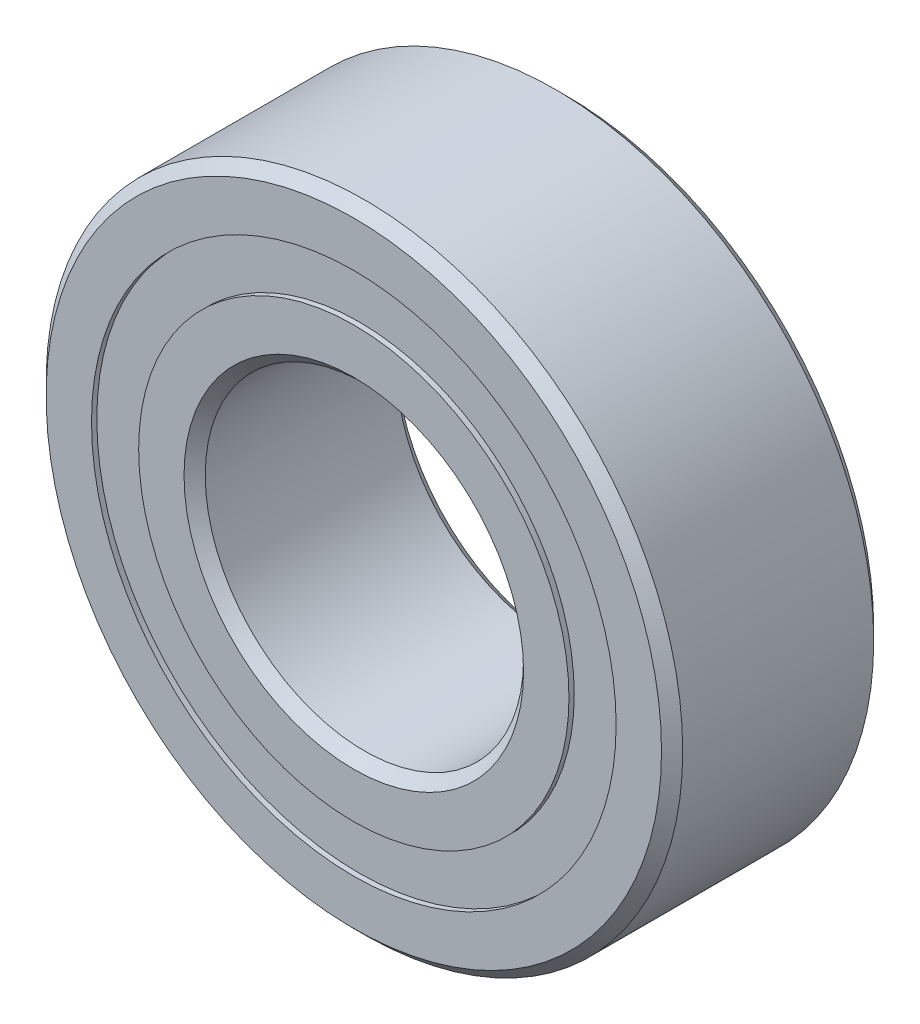
ISO-10303-21;
HEADER;
FILE_DESCRIPTION(('STEP AP214'),'2;1');
FILE_NAME('part.step','',(''),(''),'','','');
FILE_SCHEMA(('AUTOMOTIVE_DESIGN { 1 0 10303 214 1 1 1 1 }'));
ENDSEC;
DATA;
#1=APPLICATION_CONTEXT('core data for automotive mechanical design processes');
#2=APPLICATION_PROTOCOL_DEFINITION('international standard','automotive_design',2000,#1);
#3=PRODUCT_CONTEXT('',#1,'mechanical');
#4=PRODUCT('Part','Part','',(#3));
#5=PRODUCT_RELATED_PRODUCT_CATEGORY('part','',(#4));
#6=PRODUCT_DEFINITION_FORMATION('','',#4);
#7=PRODUCT_DEFINITION_CONTEXT('part definition',#1,'design');
#8=PRODUCT_DEFINITION('design','',#6,#7);
#9=PRODUCT_DEFINITION_SHAPE('','',#8);
#10=(LENGTH_UNIT() NAMED_UNIT(*) SI_UNIT(.MILLI.,.METRE.));
#11=(NAMED_UNIT(*) PLANE_ANGLE_UNIT() SI_UNIT($,.RADIAN.));
#12=(NAMED_UNIT(*) SI_UNIT($,.STERADIAN.) SOLID_ANGLE_UNIT());
#13=UNCERTAINTY_MEASURE_WITH_UNIT(LENGTH_MEASURE(1.E-05),#10,'distance_accuracy_value','');
#14=(GEOMETRIC_REPRESENTATION_CONTEXT(3) GLOBAL_UNCERTAINTY_ASSIGNED_CONTEXT((#13)) GLOBAL_UNIT_ASSIGNED_CONTEXT((#10,
#11,#12)) REPRESENTATION_CONTEXT('',''));
#15=CARTESIAN_POINT('',(0.,0.,0.));
#16=DIRECTION('',(0.,0.,1.));
#17=DIRECTION('',(1.,0.,0.));
#18=AXIS2_PLACEMENT_3D('',#15,#16,#17);
#19=CARTESIAN_POINT('',(0.,0.,0.9));
#20=DIRECTION('',(0.,0.,-1.));
#21=DIRECTION('',(-1.,0.,0.));
#22=AXIS2_PLACEMENT_3D('',#19,#20,#21);
#23=CONICAL_SURFACE('',#22,3.,0.78539816339745);
#24=CARTESIAN_POINT('',(0.,0.,1.));
#25=DIRECTION('',(0.,0.,1.));
#26=DIRECTION('',(1.,0.,0.));
#27=AXIS2_PLACEMENT_3D('',#24,#25,#26);
#28=CIRCLE('',#27,2.9);
#29=CARTESIAN_POINT('',(2.9,0.,1.));
#30=VERTEX_POINT('',#29);
#31=EDGE_CURVE('P0_E43',#30,#30,#28,.T.);
#32=ORIENTED_EDGE('',*,*,#31,.F.);
#33=EDGE_LOOP('',(#32));
#34=FACE_BOUND('',#33,.T.);
#35=CARTESIAN_POINT('',(0.,0.,0.9));
#36=DIRECTION('',(0.,0.,1.));
#37=DIRECTION('',(1.,0.,0.));
#38=AXIS2_PLACEMENT_3D('',#35,#36,#37);
#39=CIRCLE('',#38,3.);
#40=CARTESIAN_POINT('',(3.,0.,0.9));
#41=VERTEX_POINT('',#40);
#42=EDGE_CURVE('P0_E10',#41,#41,#39,.T.);
#43=ORIENTED_EDGE('',*,*,#42,.T.);
#44=EDGE_LOOP('',(#43));
#45=FACE_BOUND('',#44,.T.);
#46=ADVANCED_FACE('P0_F15',(#34,#45),#23,.T.);
#47=CARTESIAN_POINT('',(0.,0.,1.));
#48=DIRECTION('',(0.,0.,1.));
#49=DIRECTION('',(1.,0.,0.));
#50=AXIS2_PLACEMENT_3D('',#47,#48,#49);
#51=CYLINDRICAL_SURFACE('',#50,3.);
#52=ORIENTED_EDGE('',*,*,#42,.F.);
#53=EDGE_LOOP('',(#52));
#54=FACE_BOUND('',#53,.T.);
#55=CARTESIAN_POINT('',(0.,0.,-0.9));
#56=DIRECTION('',(0.,0.,1.));
#57=DIRECTION('',(1.,0.,0.));
#58=AXIS2_PLACEMENT_3D('',#55,#56,#57);
#59=CIRCLE('',#58,3.);
#60=CARTESIAN_POINT('',(3.,0.,-0.9));
#61=VERTEX_POINT('',#60);
#62=EDGE_CURVE('P0_E21',#61,#61,#59,.T.);
#63=ORIENTED_EDGE('',*,*,#62,.T.);
#64=EDGE_LOOP('',(#63));
#65=FACE_BOUND('',#64,.T.);
#66=ADVANCED_FACE('P0_F50',(#54,#65),#51,.T.);
#67=CARTESIAN_POINT('',(0.,0.,-1.));
#68=DIRECTION('',(0.,0.,1.));
#69=DIRECTION('',(1.,0.,0.));
#70=AXIS2_PLACEMENT_3D('',#67,#68,#69);
#71=CONICAL_SURFACE('',#70,2.9,0.78539816339745);
#72=ORIENTED_EDGE('',*,*,#62,.F.);
#73=EDGE_LOOP('',(#72));
#74=FACE_BOUND('',#73,.T.);
#75=CARTESIAN_POINT('',(0.,0.,-1.));
#76=DIRECTION('',(0.,0.,1.));
#77=DIRECTION('',(1.,0.,0.));
#78=AXIS2_PLACEMENT_3D('',#75,#76,#77);
#79=CIRCLE('',#78,2.9);
#80=CARTESIAN_POINT('',(2.9,0.,-1.));
#81=VERTEX_POINT('',#80);
#82=EDGE_CURVE('P0_E25',#81,#81,#79,.T.);
#83=ORIENTED_EDGE('',*,*,#82,.T.);
#84=EDGE_LOOP('',(#83));
#85=FACE_BOUND('',#84,.T.);
#86=ADVANCED_FACE('P0_F55',(#74,#85),#71,.T.);
#87=CARTESIAN_POINT('',(0.,2.9,-1.));
#88=DIRECTION('',(0.,0.,1.));
#89=DIRECTION('',(1.,0.,0.));
#90=AXIS2_PLACEMENT_3D('',#87,#88,#89);
#91=PLANE('',#90);
#92=ORIENTED_EDGE('',*,*,#82,.F.);
#93=EDGE_LOOP('',(#92));
#94=FACE_BOUND('',#93,.T.);
#95=CARTESIAN_POINT('',(0.,0.,-1.));
#96=DIRECTION('',(0.,0.,1.));
#97=DIRECTION('',(1.,0.,0.));
#98=AXIS2_PLACEMENT_3D('',#95,#96,#97);
#99=CIRCLE('',#98,2.47222222222222);
#100=CARTESIAN_POINT('',(2.47222222222222,0.,-1.));
#101=VERTEX_POINT('',#100);
#102=EDGE_CURVE('P0_E29',#101,#101,#99,.T.);
#103=ORIENTED_EDGE('',*,*,#102,.T.);
#104=EDGE_LOOP('',(#103));
#105=FACE_BOUND('',#104,.T.);
#106=ADVANCED_FACE('P0_F60',(#94,#105),#91,.F.);
#107=CARTESIAN_POINT('',(0.,0.,1.));
#108=DIRECTION('',(0.,0.,1.));
#109=DIRECTION('',(1.,0.,0.));
#110=AXIS2_PLACEMENT_3D('',#107,#108,#109);
#111=CYLINDRICAL_SURFACE('',#110,2.47222222222222);
#112=ORIENTED_EDGE('',*,*,#102,.F.);
#113=EDGE_LOOP('',(#112));
#114=FACE_BOUND('',#113,.T.);
#115=CARTESIAN_POINT('',(0.,0.,-0.444444444444445));
#116=DIRECTION('',(0.,0.,1.));
#117=DIRECTION('',(1.,0.,0.));
#118=AXIS2_PLACEMENT_3D('',#115,#116,#117);
#119=CIRCLE('',#118,2.47222222222222);
#120=CARTESIAN_POINT('',(2.47222222222222,0.,-0.444444444444445));
#121=VERTEX_POINT('',#120);
#122=EDGE_CURVE('P0_E34',#121,#121,#119,.T.);
#123=ORIENTED_EDGE('',*,*,#122,.T.);
#124=EDGE_LOOP('',(#123));
#125=FACE_BOUND('',#124,.T.);
#126=ADVANCED_FACE('P0_F66',(#114,#125),#111,.F.);
#127=CARTESIAN_POINT('',(0.,0.,0.));
#128=DIRECTION('',(0.,0.,1.));
#129=DIRECTION('',(1.,0.,0.));
#130=AXIS2_PLACEMENT_3D('',#127,#128,#129);
#131=TOROIDAL_SURFACE('',#130,2.25,0.496903994999953);
#132=ORIENTED_EDGE('',*,*,#122,.F.);
#133=EDGE_LOOP('',(#132));
#134=FACE_BOUND('',#133,.T.);
#135=CARTESIAN_POINT('',(0.,0.,0.444444444444445));
#136=DIRECTION('',(0.,0.,1.));
#137=DIRECTION('',(1.,0.,0.));
#138=AXIS2_PLACEMENT_3D('',#135,#136,#137);
#139=CIRCLE('',#138,2.47222222222222);
#140=CARTESIAN_POINT('',(2.47222222222222,0.,0.444444444444445));
#141=VERTEX_POINT('',#140);
#142=EDGE_CURVE('P0_E37',#141,#141,#139,.T.);
#143=ORIENTED_EDGE('',*,*,#142,.T.);
#144=EDGE_LOOP('',(#143));
#145=FACE_BOUND('',#144,.T.);
#146=ADVANCED_FACE('P0_F70',(#134,#145),#131,.F.);
#147=CARTESIAN_POINT('',(0.,0.,1.));
#148=DIRECTION('',(0.,0.,1.));
#149=DIRECTION('',(1.,0.,0.));
#150=AXIS2_PLACEMENT_3D('',#147,#148,#149);
#151=CYLINDRICAL_SURFACE('',#150,2.47222222222222);
#152=ORIENTED_EDGE('',*,*,#142,.F.);
#153=EDGE_LOOP('',(#152));
#154=FACE_BOUND('',#153,.T.);
#155=CARTESIAN_POINT('',(0.,0.,1.));
#156=DIRECTION('',(0.,0.,1.));
#157=DIRECTION('',(1.,0.,0.));
#158=AXIS2_PLACEMENT_3D('',#155,#156,#157);
#159=CIRCLE('',#158,2.47222222222222);
#160=CARTESIAN_POINT('',(2.47222222222222,0.,1.));
#161=VERTEX_POINT('',#160);
#162=EDGE_CURVE('P0_E40',#161,#161,#159,.T.);
#163=ORIENTED_EDGE('',*,*,#162,.T.);
#164=EDGE_LOOP('',(#163));
#165=FACE_BOUND('',#164,.T.);
#166=ADVANCED_FACE('P0_F74',(#154,#165),#151,.F.);
#167=CARTESIAN_POINT('',(0.,2.9,1.));
#168=DIRECTION('',(0.,0.,-1.));
#169=DIRECTION('',(-1.,0.,0.));
#170=AXIS2_PLACEMENT_3D('',#167,#168,#169);
#171=PLANE('',#170);
#172=ORIENTED_EDGE('',*,*,#162,.F.);
#173=EDGE_LOOP('',(#172));
#174=FACE_BOUND('',#173,.T.);
#175=ORIENTED_EDGE('',*,*,#31,.T.);
#176=EDGE_LOOP('',(#175));
#177=FACE_BOUND('',#176,.T.);
#178=ADVANCED_FACE('P0_F47',(#174,#177),#171,.F.);
#179=CLOSED_SHELL('',(#46,#66,#86,#106,#126,#146,#166,#178));
#180=MANIFOLD_SOLID_BREP('P0_B1',#179);
#181=CARTESIAN_POINT('',(-0.538460244647022,-2.18461908920862,0.));
#182=DIRECTION('',(0.,0.,1.));
#183=DIRECTION('',(-0.239315664287565,-0.97094181742605,0.));
#184=AXIS2_PLACEMENT_3D('',#181,#182,#183);
#185=SPHERICAL_SURFACE('',#184,0.496903994999953);
#186=CARTESIAN_POINT('',(-0.538460244647022,-2.18461908920862,0.496903994999953));
#187=VERTEX_POINT('',#186);
#188=VERTEX_LOOP('',#187);
#189=FACE_BOUND('',#188,.T.);
#190=ADVANCED_FACE('P1_F13',(#189),#185,.T.);
#191=CLOSED_SHELL('',(#190));
#192=MANIFOLD_SOLID_BREP('P1_B1',#191);
#193=CARTESIAN_POINT('',(-1.4920259810418,-1.68414918338497,0.));
#194=DIRECTION('',(0.,0.,1.));
#195=DIRECTION('',(-0.663122658240802,-0.748510748171095,0.));
#196=AXIS2_PLACEMENT_3D('',#193,#194,#195);
#197=SPHERICAL_SURFACE('',#196,0.496903994999953);
#198=CARTESIAN_POINT('',(-1.4920259810418,-1.68414918338497,0.496903994999953));
#199=VERTEX_POINT('',#198);
#200=VERTEX_LOOP('',#199);
#201=FACE_BOUND('',#200,.T.);
#202=ADVANCED_FACE('P2_F13',(#201),#197,.T.);
#203=CLOSED_SHELL('',(#202));
#204=MANIFOLD_SOLID_BREP('P2_B1',#203);
#205=CARTESIAN_POINT('',(-2.10378654604219,-0.797860995845685,0.));
#206=DIRECTION('',(0.,0.,1.));
#207=DIRECTION('',(-0.935016242685418,-0.354604887042527,0.));
#208=AXIS2_PLACEMENT_3D('',#205,#206,#207);
#209=SPHERICAL_SURFACE('',#208,0.496903994999953);
#210=CARTESIAN_POINT('',(-2.10378654604219,-0.797860995845685,0.496903994999953));
#211=VERTEX_POINT('',#210);
#212=VERTEX_LOOP('',#211);
#213=FACE_BOUND('',#212,.T.);
#214=ADVANCED_FACE('P3_F13',(#213),#209,.T.);
#215=CLOSED_SHELL('',(#214));
#216=MANIFOLD_SOLID_BREP('P3_B1',#215);
#217=CARTESIAN_POINT('',(-2.23359496672062,0.271207530574501,0.));
#218=DIRECTION('',(0.,0.,1.));
#219=DIRECTION('',(-0.992708874098053,0.120536680255334,0.));
#220=AXIS2_PLACEMENT_3D('',#217,#218,#219);
#221=SPHERICAL_SURFACE('',#220,0.496903994999953);
#222=CARTESIAN_POINT('',(-2.23359496672062,0.271207530574501,0.496903994999953));
#223=VERTEX_POINT('',#222);
#224=VERTEX_LOOP('',#223);
#225=FACE_BOUND('',#224,.T.);
#226=ADVANCED_FACE('P4_F13',(#225),#221,.T.);
#227=CLOSED_SHELL('',(#226));
#228=MANIFOLD_SOLID_BREP('P4_B1',#227);
#229=CARTESIAN_POINT('',(-1.85171369826071,1.27814568014512,0.));
#230=DIRECTION('',(0.,0.,1.));
#231=DIRECTION('',(-0.82298386589365,0.568064746731166,0.));
#232=AXIS2_PLACEMENT_3D('',#229,#230,#231);
#233=SPHERICAL_SURFACE('',#232,0.496903994999953);
#234=CARTESIAN_POINT('',(-1.85171369826071,1.27814568014512,0.496903994999953));
#235=VERTEX_POINT('',#234);
#236=VERTEX_LOOP('',#235);
#237=FACE_BOUND('',#236,.T.);
#238=ADVANCED_FACE('P5_F13',(#237),#233,.T.);
#239=CLOSED_SHELL('',(#238));
#240=MANIFOLD_SOLID_BREP('P5_B1',#239);
#241=CARTESIAN_POINT('',(-1.04562713709845,1.99227605771974,0.));
#242=DIRECTION('',(0.,0.,1.));
#243=DIRECTION('',(-0.464723172043757,0.885456025653216,0.));
#244=AXIS2_PLACEMENT_3D('',#241,#242,#243);
#245=SPHERICAL_SURFACE('',#244,0.496903994999953);
#246=CARTESIAN_POINT('',(-1.04562713709845,1.99227605771974,0.496903994999953));
#247=VERTEX_POINT('',#246);
#248=VERTEX_LOOP('',#247);
#249=FACE_BOUND('',#248,.T.);
#250=ADVANCED_FACE('P6_F13',(#249),#245,.T.);
#251=CLOSED_SHELL('',(#250));
#252=MANIFOLD_SOLID_BREP('P6_B1',#251);
#253=CARTESIAN_POINT('',(0.,2.47222222222222,0.95));
#254=DIRECTION('',(0.,0.,-1.));
#255=DIRECTION('',(-1.,0.,0.));
#256=AXIS2_PLACEMENT_3D('',#253,#254,#255);
#257=PLANE('',#256);
#258=CARTESIAN_POINT('',(0.,0.,0.95));
#259=DIRECTION('',(0.,0.,1.));
#260=DIRECTION('',(1.,0.,0.));
#261=AXIS2_PLACEMENT_3D('',#258,#259,#260);
#262=CIRCLE('',#261,2.02777777777778);
#263=CARTESIAN_POINT('',(2.02777777777778,0.,0.95));
#264=VERTEX_POINT('',#263);
#265=EDGE_CURVE('P7_E10',#264,#264,#262,.T.);
#266=ORIENTED_EDGE('',*,*,#265,.F.);
#267=EDGE_LOOP('',(#266));
#268=FACE_BOUND('',#267,.T.);
#269=CARTESIAN_POINT('',(0.,0.,0.95));
#270=DIRECTION('',(0.,0.,1.));
#271=DIRECTION('',(1.,0.,0.));
#272=AXIS2_PLACEMENT_3D('',#269,#270,#271);
#273=CIRCLE('',#272,2.47222222222222);
#274=CARTESIAN_POINT('',(2.47222222222222,0.,0.95));
#275=VERTEX_POINT('',#274);
#276=EDGE_CURVE('P7_E29',#275,#275,#273,.T.);
#277=ORIENTED_EDGE('',*,*,#276,.T.);
#278=EDGE_LOOP('',(#277));
#279=FACE_BOUND('',#278,.T.);
#280=ADVANCED_FACE('P7_F15',(#268,#279),#257,.F.);
#281=CARTESIAN_POINT('',(0.,0.,1.));
#282=DIRECTION('',(0.,0.,1.));
#283=DIRECTION('',(1.,0.,0.));
#284=AXIS2_PLACEMENT_3D('',#281,#282,#283);
#285=CYLINDRICAL_SURFACE('',#284,2.02777777777778);
#286=CARTESIAN_POINT('',(0.,0.,0.496903994999953));
#287=DIRECTION('',(0.,0.,1.));
#288=DIRECTION('',(1.,0.,0.));
#289=AXIS2_PLACEMENT_3D('',#286,#287,#288);
#290=CIRCLE('',#289,2.02777777777778);
#291=CARTESIAN_POINT('',(2.02777777777778,0.,0.496903994999953));
#292=VERTEX_POINT('',#291);
#293=EDGE_CURVE('P7_E21',#292,#292,#290,.T.);
#294=ORIENTED_EDGE('',*,*,#293,.F.);
#295=EDGE_LOOP('',(#294));
#296=FACE_BOUND('',#295,.T.);
#297=ORIENTED_EDGE('',*,*,#265,.T.);
#298=EDGE_LOOP('',(#297));
#299=FACE_BOUND('',#298,.T.);
#300=ADVANCED_FACE('P7_F44',(#296,#299),#285,.F.);
#301=CARTESIAN_POINT('',(0.,2.47222222222222,0.496903994999953));
#302=DIRECTION('',(0.,0.,1.));
#303=DIRECTION('',(1.,0.,0.));
#304=AXIS2_PLACEMENT_3D('',#301,#302,#303);
#305=PLANE('',#304);
#306=CARTESIAN_POINT('',(0.,0.,0.496903994999953));
#307=DIRECTION('',(0.,0.,1.));
#308=DIRECTION('',(1.,0.,0.));
#309=AXIS2_PLACEMENT_3D('',#306,#307,#308);
#310=CIRCLE('',#309,2.47222222222222);
#311=CARTESIAN_POINT('',(2.47222222222222,0.,0.496903994999953));
#312=VERTEX_POINT('',#311);
#313=EDGE_CURVE('P7_E25',#312,#312,#310,.T.);
#314=ORIENTED_EDGE('',*,*,#313,.F.);
#315=EDGE_LOOP('',(#314));
#316=FACE_BOUND('',#315,.T.);
#317=ORIENTED_EDGE('',*,*,#293,.T.);
#318=EDGE_LOOP('',(#317));
#319=FACE_BOUND('',#318,.T.);
#320=ADVANCED_FACE('P7_F39',(#316,#319),#305,.F.);
#321=CARTESIAN_POINT('',(0.,0.,1.));
#322=DIRECTION('',(0.,0.,1.));
#323=DIRECTION('',(1.,0.,0.));
#324=AXIS2_PLACEMENT_3D('',#321,#322,#323);
#325=CYLINDRICAL_SURFACE('',#324,2.47222222222222);
#326=ORIENTED_EDGE('',*,*,#276,.F.);
#327=EDGE_LOOP('',(#326));
#328=FACE_BOUND('',#327,.T.);
#329=ORIENTED_EDGE('',*,*,#313,.T.);
#330=EDGE_LOOP('',(#329));
#331=FACE_BOUND('',#330,.T.);
#332=ADVANCED_FACE('P7_F36',(#328,#331),#325,.T.);
#333=CLOSED_SHELL('',(#280,#300,#320,#332));
#334=MANIFOLD_SOLID_BREP('P7_B1',#333);
#335=CARTESIAN_POINT('',(0.,2.47222222222222,-0.496903994999953));
#336=DIRECTION('',(0.,0.,-1.));
#337=DIRECTION('',(-1.,0.,0.));
#338=AXIS2_PLACEMENT_3D('',#335,#336,#337);
#339=PLANE('',#338);
#340=CARTESIAN_POINT('',(0.,0.,-0.496903994999953));
#341=DIRECTION('',(0.,0.,1.));
#342=DIRECTION('',(1.,0.,0.));
#343=AXIS2_PLACEMENT_3D('',#340,#341,#342);
#344=CIRCLE('',#343,2.02777777777778);
#345=CARTESIAN_POINT('',(2.02777777777778,0.,-0.496903994999953));
#346=VERTEX_POINT('',#345);
#347=EDGE_CURVE('P8_E10',#346,#346,#344,.T.);
#348=ORIENTED_EDGE('',*,*,#347,.F.);
#349=EDGE_LOOP('',(#348));
#350=FACE_BOUND('',#349,.T.);
#351=CARTESIAN_POINT('',(0.,0.,-0.496903994999953));
#352=DIRECTION('',(0.,0.,1.));
#353=DIRECTION('',(1.,0.,0.));
#354=AXIS2_PLACEMENT_3D('',#351,#352,#353);
#355=CIRCLE('',#354,2.47222222222222);
#356=CARTESIAN_POINT('',(2.47222222222222,0.,-0.496903994999953));
#357=VERTEX_POINT('',#356);
#358=EDGE_CURVE('P8_E29',#357,#357,#355,.T.);
#359=ORIENTED_EDGE('',*,*,#358,.T.);
#360=EDGE_LOOP('',(#359));
#361=FACE_BOUND('',#360,.T.);
#362=ADVANCED_FACE('P8_F15',(#350,#361),#339,.F.);
#363=CARTESIAN_POINT('',(0.,0.,1.));
#364=DIRECTION('',(0.,0.,1.));
#365=DIRECTION('',(1.,0.,0.));
#366=AXIS2_PLACEMENT_3D('',#363,#364,#365);
#367=CYLINDRICAL_SURFACE('',#366,2.02777777777778);
#368=CARTESIAN_POINT('',(0.,0.,-0.95));
#369=DIRECTION('',(0.,0.,1.));
#370=DIRECTION('',(1.,0.,0.));
#371=AXIS2_PLACEMENT_3D('',#368,#369,#370);
#372=CIRCLE('',#371,2.02777777777778);
#373=CARTESIAN_POINT('',(2.02777777777778,0.,-0.95));
#374=VERTEX_POINT('',#373);
#375=EDGE_CURVE('P8_E21',#374,#374,#372,.T.);
#376=ORIENTED_EDGE('',*,*,#375,.F.);
#377=EDGE_LOOP('',(#376));
#378=FACE_BOUND('',#377,.T.);
#379=ORIENTED_EDGE('',*,*,#347,.T.);
#380=EDGE_LOOP('',(#379));
#381=FACE_BOUND('',#380,.T.);
#382=ADVANCED_FACE('P8_F44',(#378,#381),#367,.F.);
#383=CARTESIAN_POINT('',(0.,2.47222222222222,-0.95));
#384=DIRECTION('',(0.,0.,1.));
#385=DIRECTION('',(1.,0.,0.));
#386=AXIS2_PLACEMENT_3D('',#383,#384,#385);
#387=PLANE('',#386);
#388=CARTESIAN_POINT('',(0.,0.,-0.95));
#389=DIRECTION('',(0.,0.,1.));
#390=DIRECTION('',(1.,0.,0.));
#391=AXIS2_PLACEMENT_3D('',#388,#389,#390);
#392=CIRCLE('',#391,2.47222222222222);
#393=CARTESIAN_POINT('',(2.47222222222222,0.,-0.95));
#394=VERTEX_POINT('',#393);
#395=EDGE_CURVE('P8_E25',#394,#394,#392,.T.);
#396=ORIENTED_EDGE('',*,*,#395,.F.);
#397=EDGE_LOOP('',(#396));
#398=FACE_BOUND('',#397,.T.);
#399=ORIENTED_EDGE('',*,*,#375,.T.);
#400=EDGE_LOOP('',(#399));
#401=FACE_BOUND('',#400,.T.);
#402=ADVANCED_FACE('P8_F39',(#398,#401),#387,.F.);
#403=CARTESIAN_POINT('',(0.,0.,1.));
#404=DIRECTION('',(0.,0.,1.));
#405=DIRECTION('',(1.,0.,0.));
#406=AXIS2_PLACEMENT_3D('',#403,#404,#405);
#407=CYLINDRICAL_SURFACE('',#406,2.47222222222222);
#408=ORIENTED_EDGE('',*,*,#358,.F.);
#409=EDGE_LOOP('',(#408));
#410=FACE_BOUND('',#409,.T.);
#411=ORIENTED_EDGE('',*,*,#395,.T.);
#412=EDGE_LOOP('',(#411));
#413=FACE_BOUND('',#412,.T.);
#414=ADVANCED_FACE('P8_F36',(#410,#413),#407,.T.);
#415=CLOSED_SHELL('',(#362,#382,#402,#414));
#416=MANIFOLD_SOLID_BREP('P8_B1',#415);
#417=CARTESIAN_POINT('',(0.,2.02777777777778,1.));
#418=DIRECTION('',(0.,0.,-1.));
#419=DIRECTION('',(-1.,0.,0.));
#420=AXIS2_PLACEMENT_3D('',#417,#418,#419);
#421=PLANE('',#420);
#422=CARTESIAN_POINT('',(0.,0.,1.));
#423=DIRECTION('',(0.,0.,1.));
#424=DIRECTION('',(1.,0.,0.));
#425=AXIS2_PLACEMENT_3D('',#422,#423,#424);
#426=CIRCLE('',#425,1.6);
#427=CARTESIAN_POINT('',(1.6,0.,1.));
#428=VERTEX_POINT('',#427);
#429=EDGE_CURVE('P9_E10',#428,#428,#426,.T.);
#430=ORIENTED_EDGE('',*,*,#429,.F.);
#431=EDGE_LOOP('',(#430));
#432=FACE_BOUND('',#431,.T.);
#433=CARTESIAN_POINT('',(0.,0.,1.));
#434=DIRECTION('',(0.,0.,1.));
#435=DIRECTION('',(1.,0.,0.));
#436=AXIS2_PLACEMENT_3D('',#433,#434,#435);
#437=CIRCLE('',#436,2.02777777777778);
#438=CARTESIAN_POINT('',(2.02777777777778,0.,1.));
#439=VERTEX_POINT('',#438);
#440=EDGE_CURVE('P9_E43',#439,#439,#437,.T.);
#441=ORIENTED_EDGE('',*,*,#440,.T.);
#442=EDGE_LOOP('',(#441));
#443=FACE_BOUND('',#442,.T.);
#444=ADVANCED_FACE('P9_F15',(#432,#443),#421,.F.);
#445=CARTESIAN_POINT('',(0.,0.,1.));
#446=DIRECTION('',(0.,0.,1.));
#447=DIRECTION('',(1.,0.,0.));
#448=AXIS2_PLACEMENT_3D('',#445,#446,#447);
#449=CONICAL_SURFACE('',#448,1.6,0.785398163397446);
#450=CARTESIAN_POINT('',(0.,0.,0.9));
#451=DIRECTION('',(0.,0.,1.));
#452=DIRECTION('',(1.,0.,0.));
#453=AXIS2_PLACEMENT_3D('',#450,#451,#452);
#454=CIRCLE('',#453,1.5);
#455=CARTESIAN_POINT('',(1.5,0.,0.9));
#456=VERTEX_POINT('',#455);
#457=EDGE_CURVE('P9_E21',#456,#456,#454,.T.);
#458=ORIENTED_EDGE('',*,*,#457,.F.);
#459=EDGE_LOOP('',(#458));
#460=FACE_BOUND('',#459,.T.);
#461=ORIENTED_EDGE('',*,*,#429,.T.);
#462=EDGE_LOOP('',(#461));
#463=FACE_BOUND('',#462,.T.);
#464=ADVANCED_FACE('P9_F80',(#460,#463),#449,.F.);
#465=CARTESIAN_POINT('',(0.,0.,1.));
#466=DIRECTION('',(0.,0.,1.));
#467=DIRECTION('',(1.,0.,0.));
#468=AXIS2_PLACEMENT_3D('',#465,#466,#467);
#469=CYLINDRICAL_SURFACE('',#468,1.5);
#470=CARTESIAN_POINT('',(0.,0.,-0.9));
#471=DIRECTION('',(0.,0.,1.));
#472=DIRECTION('',(1.,0.,0.));
#473=AXIS2_PLACEMENT_3D('',#470,#471,#472);
#474=CIRCLE('',#473,1.5);
#475=CARTESIAN_POINT('',(1.5,0.,-0.9));
#476=VERTEX_POINT('',#475);
#477=EDGE_CURVE('P9_E25',#476,#476,#474,.T.);
#478=ORIENTED_EDGE('',*,*,#477,.F.);
#479=EDGE_LOOP('',(#478));
#480=FACE_BOUND('',#479,.T.);
#481=ORIENTED_EDGE('',*,*,#457,.T.);
#482=EDGE_LOOP('',(#481));
#483=FACE_BOUND('',#482,.T.);
#484=ADVANCED_FACE('P9_F75',(#480,#483),#469,.F.);
#485=CARTESIAN_POINT('',(0.,0.,-0.9));
#486=DIRECTION('',(0.,0.,-1.));
#487=DIRECTION('',(-1.,0.,0.));
#488=AXIS2_PLACEMENT_3D('',#485,#486,#487);
#489=CONICAL_SURFACE('',#488,1.5,0.785398163397446);
#490=CARTESIAN_POINT('',(0.,0.,-1.));
#491=DIRECTION('',(0.,0.,1.));
#492=DIRECTION('',(1.,0.,0.));
#493=AXIS2_PLACEMENT_3D('',#490,#491,#492);
#494=CIRCLE('',#493,1.6);
#495=CARTESIAN_POINT('',(1.6,0.,-1.));
#496=VERTEX_POINT('',#495);
#497=EDGE_CURVE('P9_E29',#496,#496,#494,.T.);
#498=ORIENTED_EDGE('',*,*,#497,.F.);
#499=EDGE_LOOP('',(#498));
#500=FACE_BOUND('',#499,.T.);
#501=ORIENTED_EDGE('',*,*,#477,.T.);
#502=EDGE_LOOP('',(#501));
#503=FACE_BOUND('',#502,.T.);
#504=ADVANCED_FACE('P9_F69',(#500,#503),#489,.F.);
#505=CARTESIAN_POINT('',(0.,2.02777777777778,-1.));
#506=DIRECTION('',(0.,0.,1.));
#507=DIRECTION('',(1.,0.,0.));
#508=AXIS2_PLACEMENT_3D('',#505,#506,#507);
#509=PLANE('',#508);
#510=CARTESIAN_POINT('',(0.,0.,-1.));
#511=DIRECTION('',(0.,0.,1.));
#512=DIRECTION('',(1.,0.,0.));
#513=AXIS2_PLACEMENT_3D('',#510,#511,#512);
#514=CIRCLE('',#513,2.02777777777778);
#515=CARTESIAN_POINT('',(2.02777777777778,0.,-1.));
#516=VERTEX_POINT('',#515);
#517=EDGE_CURVE('P9_E34',#516,#516,#514,.T.);
#518=ORIENTED_EDGE('',*,*,#517,.F.);
#519=EDGE_LOOP('',(#518));
#520=FACE_BOUND('',#519,.T.);
#521=ORIENTED_EDGE('',*,*,#497,.T.);
#522=EDGE_LOOP('',(#521));
#523=FACE_BOUND('',#522,.T.);
#524=ADVANCED_FACE('P9_F63',(#520,#523),#509,.F.);
#525=CARTESIAN_POINT('',(0.,0.,1.));
#526=DIRECTION('',(0.,0.,1.));
#527=DIRECTION('',(1.,0.,0.));
#528=AXIS2_PLACEMENT_3D('',#525,#526,#527);
#529=CYLINDRICAL_SURFACE('',#528,2.02777777777778);
#530=CARTESIAN_POINT('',(0.,0.,-0.444444444444445));
#531=DIRECTION('',(0.,0.,1.));
#532=DIRECTION('',(1.,0.,0.));
#533=AXIS2_PLACEMENT_3D('',#530,#531,#532);
#534=CIRCLE('',#533,2.02777777777778);
#535=CARTESIAN_POINT('',(2.02777777777778,0.,-0.444444444444445));
#536=VERTEX_POINT('',#535);
#537=EDGE_CURVE('P9_E37',#536,#536,#534,.T.);
#538=ORIENTED_EDGE('',*,*,#537,.F.);
#539=EDGE_LOOP('',(#538));
#540=FACE_BOUND('',#539,.T.);
#541=ORIENTED_EDGE('',*,*,#517,.T.);
#542=EDGE_LOOP('',(#541));
#543=FACE_BOUND('',#542,.T.);
#544=ADVANCED_FACE('P9_F57',(#540,#543),#529,.T.);
#545=CARTESIAN_POINT('',(0.,0.,0.));
#546=DIRECTION('',(0.,0.,1.));
#547=DIRECTION('',(1.,0.,0.));
#548=AXIS2_PLACEMENT_3D('',#545,#546,#547);
#549=TOROIDAL_SURFACE('',#548,2.25,0.496903994999953);
#550=CARTESIAN_POINT('',(0.,0.,0.444444444444445));
#551=DIRECTION('',(0.,0.,1.));
#552=DIRECTION('',(1.,0.,0.));
#553=AXIS2_PLACEMENT_3D('',#550,#551,#552);
#554=CIRCLE('',#553,2.02777777777778);
#555=CARTESIAN_POINT('',(2.02777777777778,0.,0.444444444444445));
#556=VERTEX_POINT('',#555);
#557=EDGE_CURVE('P9_E40',#556,#556,#554,.T.);
#558=ORIENTED_EDGE('',*,*,#557,.F.);
#559=EDGE_LOOP('',(#558));
#560=FACE_BOUND('',#559,.T.);
#561=ORIENTED_EDGE('',*,*,#537,.T.);
#562=EDGE_LOOP('',(#561));
#563=FACE_BOUND('',#562,.T.);
#564=ADVANCED_FACE('P9_F51',(#560,#563),#549,.F.);
#565=CARTESIAN_POINT('',(0.,0.,1.));
#566=DIRECTION('',(0.,0.,1.));
#567=DIRECTION('',(1.,0.,0.));
#568=AXIS2_PLACEMENT_3D('',#565,#566,#567);
#569=CYLINDRICAL_SURFACE('',#568,2.02777777777778);
#570=ORIENTED_EDGE('',*,*,#440,.F.);
#571=EDGE_LOOP('',(#570));
#572=FACE_BOUND('',#571,.T.);
#573=ORIENTED_EDGE('',*,*,#557,.T.);
#574=EDGE_LOOP('',(#573));
#575=FACE_BOUND('',#574,.T.);
#576=ADVANCED_FACE('P9_F48',(#572,#575),#569,.T.);
#577=CLOSED_SHELL('',(#444,#464,#484,#504,#524,#544,#564,#576));
#578=MANIFOLD_SOLID_BREP('P9_B1',#577);
#579=CARTESIAN_POINT('',(0.,2.25,0.));
#580=DIRECTION('',(0.,0.,1.));
#581=DIRECTION('',(0.,1.,0.));
#582=AXIS2_PLACEMENT_3D('',#579,#580,#581);
#583=SPHERICAL_SURFACE('',#582,0.496903994999953);
#584=CARTESIAN_POINT('',(0.,2.25,0.496903994999953));
#585=VERTEX_POINT('',#584);
#586=VERTEX_LOOP('',#585);
#587=FACE_BOUND('',#586,.T.);
#588=ADVANCED_FACE('P10_F13',(#587),#583,.T.);
#589=CLOSED_SHELL('',(#588));
#590=MANIFOLD_SOLID_BREP('P10_B1',#589);
#591=CARTESIAN_POINT('',(1.04562713709848,1.99227605771972,0.));
#592=DIRECTION('',(0.,0.,1.));
#593=DIRECTION('',(0.46472317204377,0.885456025653209,0.));
#594=AXIS2_PLACEMENT_3D('',#591,#592,#593);
#595=SPHERICAL_SURFACE('',#594,0.496903994999953);
#596=CARTESIAN_POINT('',(1.04562713709848,1.99227605771972,0.496903994999953));
#597=VERTEX_POINT('',#596);
#598=VERTEX_LOOP('',#597);
#599=FACE_BOUND('',#598,.T.);
#600=ADVANCED_FACE('P11_F13',(#599),#595,.T.);
#601=CLOSED_SHELL('',(#600));
#602=MANIFOLD_SOLID_BREP('P11_B1',#601);
#603=CARTESIAN_POINT('',(1.85171369826073,1.2781456801451,0.));
#604=DIRECTION('',(0.,0.,1.));
#605=DIRECTION('',(0.822983865893658,0.568064746731154,0.));
#606=AXIS2_PLACEMENT_3D('',#603,#604,#605);
#607=SPHERICAL_SURFACE('',#606,0.496903994999953);
#608=CARTESIAN_POINT('',(1.85171369826073,1.2781456801451,0.496903994999953));
#609=VERTEX_POINT('',#608);
#610=VERTEX_LOOP('',#609);
#611=FACE_BOUND('',#610,.T.);
#612=ADVANCED_FACE('P12_F13',(#611),#607,.T.);
#613=CLOSED_SHELL('',(#612));
#614=MANIFOLD_SOLID_BREP('P12_B1',#613);
#615=CARTESIAN_POINT('',(2.23359496672062,0.27120753057447,0.));
#616=DIRECTION('',(0.,0.,1.));
#617=DIRECTION('',(0.992708874098054,0.12053668025532,0.));
#618=AXIS2_PLACEMENT_3D('',#615,#616,#617);
#619=SPHERICAL_SURFACE('',#618,0.496903994999953);
#620=CARTESIAN_POINT('',(2.23359496672062,0.27120753057447,0.496903994999953));
#621=VERTEX_POINT('',#620);
#622=VERTEX_LOOP('',#621);
#623=FACE_BOUND('',#622,.T.);
#624=ADVANCED_FACE('P13_F13',(#623),#619,.T.);
#625=CLOSED_SHELL('',(#624));
#626=MANIFOLD_SOLID_BREP('P13_B1',#625);
#627=CARTESIAN_POINT('',(2.10378654604218,-0.797860995845714,0.));
#628=DIRECTION('',(0.,0.,1.));
#629=DIRECTION('',(0.935016242685413,-0.35460488704254,0.));
#630=AXIS2_PLACEMENT_3D('',#627,#628,#629);
#631=SPHERICAL_SURFACE('',#630,0.496903994999953);
#632=CARTESIAN_POINT('',(2.10378654604218,-0.797860995845714,0.496903994999953));
#633=VERTEX_POINT('',#632);
#634=VERTEX_LOOP('',#633);
#635=FACE_BOUND('',#634,.T.);
#636=ADVANCED_FACE('P14_F13',(#635),#631,.T.);
#637=CLOSED_SHELL('',(#636));
#638=MANIFOLD_SOLID_BREP('P14_B1',#637);
#639=CARTESIAN_POINT('',(1.49202598104178,-1.68414918338498,0.));
#640=DIRECTION('',(0.,0.,1.));
#641=DIRECTION('',(0.663122658240791,-0.748510748171105,0.));
#642=AXIS2_PLACEMENT_3D('',#639,#640,#641);
#643=SPHERICAL_SURFACE('',#642,0.496903994999953);
#644=CARTESIAN_POINT('',(1.49202598104178,-1.68414918338498,0.496903994999953));
#645=VERTEX_POINT('',#644);
#646=VERTEX_LOOP('',#645);
#647=FACE_BOUND('',#646,.T.);
#648=ADVANCED_FACE('P15_F13',(#647),#643,.T.);
#649=CLOSED_SHELL('',(#648));
#650=MANIFOLD_SOLID_BREP('P15_B1',#649);
#651=CARTESIAN_POINT('',(0.538460244646991,-2.18461908920862,0.));
#652=DIRECTION('',(0.,0.,1.));
#653=DIRECTION('',(0.239315664287552,-0.970941817426054,0.));
#654=AXIS2_PLACEMENT_3D('',#651,#652,#653);
#655=SPHERICAL_SURFACE('',#654,0.496903994999953);
#656=CARTESIAN_POINT('',(0.538460244646991,-2.18461908920862,0.496903994999953));
#657=VERTEX_POINT('',#656);
#658=VERTEX_LOOP('',#657);
#659=FACE_BOUND('',#658,.T.);
#660=ADVANCED_FACE('P16_F13',(#659),#655,.T.);
#661=CLOSED_SHELL('',(#660));
#662=MANIFOLD_SOLID_BREP('P16_B1',#661);
#663=ADVANCED_BREP_SHAPE_REPRESENTATION('',(#18,#180,#192,#204,#216,#228,#240,#252,#334,#416,
#578,#590,#602,#614,#626,#638,#650,#662),#14);
#664=SHAPE_DEFINITION_REPRESENTATION(#9,#663);
ENDSEC;
END-ISO-10303-21;
